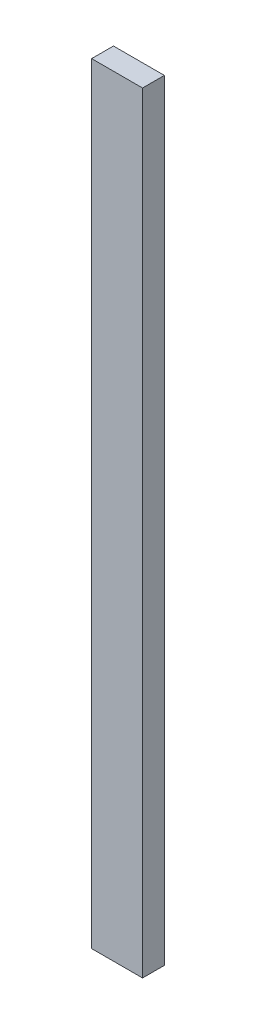
ISO-10303-21;
HEADER;
FILE_DESCRIPTION(('STEP AP214'),'2;1');
FILE_NAME('part.step','',(''),(''),'','','');
FILE_SCHEMA(('AUTOMOTIVE_DESIGN { 1 0 10303 214 1 1 1 1 }'));
ENDSEC;
DATA;
#1=APPLICATION_CONTEXT('core data for automotive mechanical design processes');
#2=APPLICATION_PROTOCOL_DEFINITION('international standard','automotive_design',2000,#1);
#3=PRODUCT_CONTEXT('',#1,'mechanical');
#4=PRODUCT('Part','Part','',(#3));
#5=PRODUCT_RELATED_PRODUCT_CATEGORY('part','',(#4));
#6=PRODUCT_DEFINITION_FORMATION('','',#4);
#7=PRODUCT_DEFINITION_CONTEXT('part definition',#1,'design');
#8=PRODUCT_DEFINITION('design','',#6,#7);
#9=PRODUCT_DEFINITION_SHAPE('','',#8);
#10=(LENGTH_UNIT() NAMED_UNIT(*) SI_UNIT(.MILLI.,.METRE.));
#11=(NAMED_UNIT(*) PLANE_ANGLE_UNIT() SI_UNIT($,.RADIAN.));
#12=(NAMED_UNIT(*) SI_UNIT($,.STERADIAN.) SOLID_ANGLE_UNIT());
#13=UNCERTAINTY_MEASURE_WITH_UNIT(LENGTH_MEASURE(1.E-05),#10,'distance_accuracy_value','');
#14=(GEOMETRIC_REPRESENTATION_CONTEXT(3) GLOBAL_UNCERTAINTY_ASSIGNED_CONTEXT((#13)) GLOBAL_UNIT_ASSIGNED_CONTEXT((#10,
#11,#12)) REPRESENTATION_CONTEXT('',''));
#15=CARTESIAN_POINT('',(0.,0.,0.));
#16=DIRECTION('',(0.,0.,1.));
#17=DIRECTION('',(1.,0.,0.));
#18=AXIS2_PLACEMENT_3D('',#15,#16,#17);
#19=CARTESIAN_POINT('',(44.45,1346.2,19.05));
#20=DIRECTION('',(-1.,0.,0.));
#21=DIRECTION('',(0.,0.,1.));
#22=AXIS2_PLACEMENT_3D('',#19,#20,#21);
#23=PLANE('',#22);
#24=DIRECTION('',(0.,0.,-1.));
#25=VECTOR('',#24,1.);
#26=CARTESIAN_POINT('',(44.45,0.,19.05));
#27=LINE('',#26,#25);
#28=CARTESIAN_POINT('',(44.45,0.,19.05));
#29=VERTEX_POINT('',#28);
#30=CARTESIAN_POINT('',(44.45,0.,-19.05));
#31=VERTEX_POINT('',#30);
#32=EDGE_CURVE('E107',#29,#31,#27,.T.);
#33=ORIENTED_EDGE('',*,*,#32,.T.);
#34=DIRECTION('',(0.,-1.,0.));
#35=VECTOR('',#34,1.);
#36=CARTESIAN_POINT('',(44.45,1346.2,-19.05));
#37=LINE('',#36,#35);
#38=CARTESIAN_POINT('',(44.45,1346.2,-19.05));
#39=VERTEX_POINT('',#38);
#40=EDGE_CURVE('E11',#39,#31,#37,.T.);
#41=ORIENTED_EDGE('',*,*,#40,.F.);
#42=DIRECTION('',(0.,0.,-1.));
#43=VECTOR('',#42,1.);
#44=CARTESIAN_POINT('',(44.45,1346.2,19.05));
#45=LINE('',#44,#43);
#46=CARTESIAN_POINT('',(44.45,1346.2,19.05));
#47=VERTEX_POINT('',#46);
#48=EDGE_CURVE('E91',#47,#39,#45,.T.);
#49=ORIENTED_EDGE('',*,*,#48,.F.);
#50=DIRECTION('',(0.,-1.,0.));
#51=VECTOR('',#50,1.);
#52=CARTESIAN_POINT('',(44.45,1346.2,19.05));
#53=LINE('',#52,#51);
#54=EDGE_CURVE('E103',#47,#29,#53,.T.);
#55=ORIENTED_EDGE('',*,*,#54,.T.);
#56=EDGE_LOOP('',(#33,#41,#49,#55));
#57=FACE_BOUND('',#56,.T.);
#58=ADVANCED_FACE('F39',(#57),#23,.F.);
#59=CARTESIAN_POINT('',(-44.45,1346.2,-19.05));
#60=DIRECTION('',(0.,0.,1.));
#61=DIRECTION('',(1.,0.,0.));
#62=AXIS2_PLACEMENT_3D('',#59,#60,#61);
#63=PLANE('',#62);
#64=DIRECTION('',(-1.,0.,0.));
#65=VECTOR('',#64,1.);
#66=CARTESIAN_POINT('',(-44.45,0.,-19.05));
#67=LINE('',#66,#65);
#68=CARTESIAN_POINT('',(-44.45,0.,-19.05));
#69=VERTEX_POINT('',#68);
#70=EDGE_CURVE('E96',#31,#69,#67,.T.);
#71=ORIENTED_EDGE('',*,*,#70,.T.);
#72=DIRECTION('',(0.,-1.,0.));
#73=VECTOR('',#72,1.);
#74=CARTESIAN_POINT('',(-44.45,1346.2,-19.05));
#75=LINE('',#74,#73);
#76=CARTESIAN_POINT('',(-44.45,1346.2,-19.05));
#77=VERTEX_POINT('',#76);
#78=EDGE_CURVE('E48',#77,#69,#75,.T.);
#79=ORIENTED_EDGE('',*,*,#78,.F.);
#80=DIRECTION('',(-1.,0.,0.));
#81=VECTOR('',#80,1.);
#82=CARTESIAN_POINT('',(-44.45,1346.2,-19.05));
#83=LINE('',#82,#81);
#84=EDGE_CURVE('E86',#39,#77,#83,.T.);
#85=ORIENTED_EDGE('',*,*,#84,.F.);
#86=ORIENTED_EDGE('',*,*,#40,.T.);
#87=EDGE_LOOP('',(#71,#79,#85,#86));
#88=FACE_BOUND('',#87,.T.);
#89=ADVANCED_FACE('F95',(#88),#63,.F.);
#90=CARTESIAN_POINT('',(-44.45,1346.2,19.05));
#91=DIRECTION('',(1.,0.,0.));
#92=DIRECTION('',(0.,0.,-1.));
#93=AXIS2_PLACEMENT_3D('',#90,#91,#92);
#94=PLANE('',#93);
#95=DIRECTION('',(0.,0.,1.));
#96=VECTOR('',#95,1.);
#97=CARTESIAN_POINT('',(-44.45,0.,19.05));
#98=LINE('',#97,#96);
#99=CARTESIAN_POINT('',(-44.45,0.,19.05));
#100=VERTEX_POINT('',#99);
#101=EDGE_CURVE('E73',#69,#100,#98,.T.);
#102=ORIENTED_EDGE('',*,*,#101,.T.);
#103=DIRECTION('',(0.,-1.,0.));
#104=VECTOR('',#103,1.);
#105=CARTESIAN_POINT('',(-44.45,1346.2,19.05));
#106=LINE('',#105,#104);
#107=CARTESIAN_POINT('',(-44.45,1346.2,19.05));
#108=VERTEX_POINT('',#107);
#109=EDGE_CURVE('E98',#108,#100,#106,.T.);
#110=ORIENTED_EDGE('',*,*,#109,.F.);
#111=DIRECTION('',(0.,0.,1.));
#112=VECTOR('',#111,1.);
#113=CARTESIAN_POINT('',(-44.45,1346.2,19.05));
#114=LINE('',#113,#112);
#115=EDGE_CURVE('E89',#77,#108,#114,.T.);
#116=ORIENTED_EDGE('',*,*,#115,.F.);
#117=ORIENTED_EDGE('',*,*,#78,.T.);
#118=EDGE_LOOP('',(#102,#110,#116,#117));
#119=FACE_BOUND('',#118,.T.);
#120=ADVANCED_FACE('F99',(#119),#94,.F.);
#121=CARTESIAN_POINT('',(-44.45,1346.2,19.05));
#122=DIRECTION('',(0.,0.,-1.));
#123=DIRECTION('',(-1.,0.,0.));
#124=AXIS2_PLACEMENT_3D('',#121,#122,#123);
#125=PLANE('',#124);
#126=DIRECTION('',(1.,0.,0.));
#127=VECTOR('',#126,1.);
#128=CARTESIAN_POINT('',(-44.45,0.,19.05));
#129=LINE('',#128,#127);
#130=EDGE_CURVE('E79',#100,#29,#129,.T.);
#131=ORIENTED_EDGE('',*,*,#130,.T.);
#132=ORIENTED_EDGE('',*,*,#54,.F.);
#133=DIRECTION('',(1.,0.,0.));
#134=VECTOR('',#133,1.);
#135=CARTESIAN_POINT('',(-44.45,1346.2,19.05));
#136=LINE('',#135,#134);
#137=EDGE_CURVE('E56',#108,#47,#136,.T.);
#138=ORIENTED_EDGE('',*,*,#137,.F.);
#139=ORIENTED_EDGE('',*,*,#109,.T.);
#140=EDGE_LOOP('',(#131,#132,#138,#139));
#141=FACE_BOUND('',#140,.T.);
#142=ADVANCED_FACE('F120',(#141),#125,.F.);
#143=CARTESIAN_POINT('',(0.,1346.2,0.));
#144=DIRECTION('',(0.,-1.,0.));
#145=DIRECTION('',(0.,0.,-1.));
#146=AXIS2_PLACEMENT_3D('',#143,#144,#145);
#147=PLANE('',#146);
#148=ORIENTED_EDGE('',*,*,#48,.T.);
#149=ORIENTED_EDGE('',*,*,#84,.T.);
#150=ORIENTED_EDGE('',*,*,#115,.T.);
#151=ORIENTED_EDGE('',*,*,#137,.T.);
#152=EDGE_LOOP('',(#148,#149,#150,#151));
#153=FACE_BOUND('',#152,.T.);
#154=ADVANCED_FACE('F87',(#153),#147,.F.);
#155=CARTESIAN_POINT('',(0.,0.,0.));
#156=DIRECTION('',(0.,-1.,0.));
#157=DIRECTION('',(0.,0.,-1.));
#158=AXIS2_PLACEMENT_3D('',#155,#156,#157);
#159=PLANE('',#158);
#160=ORIENTED_EDGE('',*,*,#32,.F.);
#161=ORIENTED_EDGE('',*,*,#130,.F.);
#162=ORIENTED_EDGE('',*,*,#101,.F.);
#163=ORIENTED_EDGE('',*,*,#70,.F.);
#164=EDGE_LOOP('',(#160,#161,#162,#163));
#165=FACE_BOUND('',#164,.T.);
#166=ADVANCED_FACE('F123',(#165),#159,.T.);
#167=CLOSED_SHELL('',(#58,#89,#120,#142,#154,#166));
#168=MANIFOLD_SOLID_BREP('B2',#167);
#169=ADVANCED_BREP_SHAPE_REPRESENTATION('',(#18,#168),#14);
#170=SHAPE_DEFINITION_REPRESENTATION(#9,#169);
ENDSEC;
END-ISO-10303-21;
